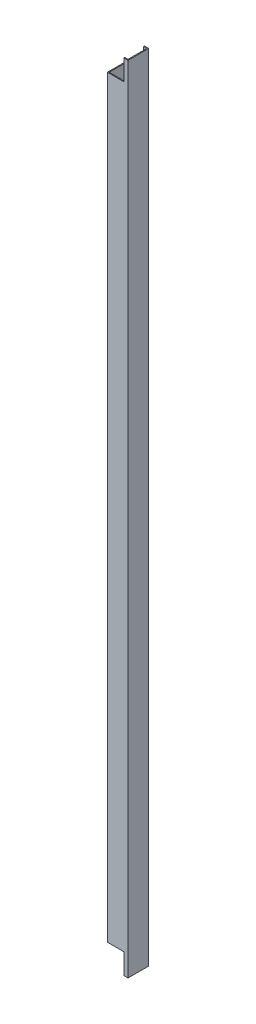
ISO-10303-21;
HEADER;
FILE_DESCRIPTION(('STEP AP214'),'2;1');
FILE_NAME('part.step','',(''),(''),'','','');
FILE_SCHEMA(('AUTOMOTIVE_DESIGN { 1 0 10303 214 1 1 1 1 }'));
ENDSEC;
DATA;
#1=APPLICATION_CONTEXT('core data for automotive mechanical design processes');
#2=APPLICATION_PROTOCOL_DEFINITION('international standard','automotive_design',2000,#1);
#3=PRODUCT_CONTEXT('',#1,'mechanical');
#4=PRODUCT('Part','Part','',(#3));
#5=PRODUCT_RELATED_PRODUCT_CATEGORY('part','',(#4));
#6=PRODUCT_DEFINITION_FORMATION('','',#4);
#7=PRODUCT_DEFINITION_CONTEXT('part definition',#1,'design');
#8=PRODUCT_DEFINITION('design','',#6,#7);
#9=PRODUCT_DEFINITION_SHAPE('','',#8);
#10=(LENGTH_UNIT() NAMED_UNIT(*) SI_UNIT(.MILLI.,.METRE.));
#11=(NAMED_UNIT(*) PLANE_ANGLE_UNIT() SI_UNIT($,.RADIAN.));
#12=(NAMED_UNIT(*) SI_UNIT($,.STERADIAN.) SOLID_ANGLE_UNIT());
#13=UNCERTAINTY_MEASURE_WITH_UNIT(LENGTH_MEASURE(1.E-05),#10,'distance_accuracy_value','');
#14=(GEOMETRIC_REPRESENTATION_CONTEXT(3) GLOBAL_UNCERTAINTY_ASSIGNED_CONTEXT((#13)) GLOBAL_UNIT_ASSIGNED_CONTEXT((#10,
#11,#12)) REPRESENTATION_CONTEXT('',''));
#15=CARTESIAN_POINT('',(0.,0.,0.));
#16=DIRECTION('',(0.,0.,1.));
#17=DIRECTION('',(1.,0.,0.));
#18=AXIS2_PLACEMENT_3D('',#15,#16,#17);
#19=CARTESIAN_POINT('',(0.,1923.,0.));
#20=DIRECTION('',(0.,-1.,0.));
#21=DIRECTION('',(0.,0.,-1.));
#22=AXIS2_PLACEMENT_3D('',#19,#20,#21);
#23=PLANE('',#22);
#24=DIRECTION('',(-1.,0.,0.));
#25=VECTOR('',#24,1.);
#26=CARTESIAN_POINT('',(0.,1923.,-50.));
#27=LINE('',#26,#25);
#28=CARTESIAN_POINT('',(50.,1923.,-50.));
#29=VERTEX_POINT('',#28);
#30=CARTESIAN_POINT('',(40.,1923.,-50.));
#31=VERTEX_POINT('',#30);
#32=EDGE_CURVE('E184',#29,#31,#27,.T.);
#33=ORIENTED_EDGE('',*,*,#32,.T.);
#34=DIRECTION('',(0.,0.,1.));
#35=VECTOR('',#34,1.);
#36=CARTESIAN_POINT('',(40.,1923.,-50.));
#37=LINE('',#36,#35);
#38=CARTESIAN_POINT('',(40.,1923.,-47.8));
#39=VERTEX_POINT('',#38);
#40=EDGE_CURVE('E257',#31,#39,#37,.T.);
#41=ORIENTED_EDGE('',*,*,#40,.T.);
#42=DIRECTION('',(-1.,0.,0.));
#43=VECTOR('',#42,1.);
#44=CARTESIAN_POINT('',(2.2,1923.,-47.8));
#45=LINE('',#44,#43);
#46=CARTESIAN_POINT('',(47.8,1923.,-47.8));
#47=VERTEX_POINT('',#46);
#48=EDGE_CURVE('E208',#47,#39,#45,.T.);
#49=ORIENTED_EDGE('',*,*,#48,.F.);
#50=DIRECTION('',(0.,0.,-1.));
#51=VECTOR('',#50,1.);
#52=CARTESIAN_POINT('',(47.8,1923.,-47.8));
#53=LINE('',#52,#51);
#54=CARTESIAN_POINT('',(47.8,1923.,-2.2));
#55=VERTEX_POINT('',#54);
#56=EDGE_CURVE('E213',#55,#47,#53,.T.);
#57=ORIENTED_EDGE('',*,*,#56,.F.);
#58=DIRECTION('',(1.,0.,0.));
#59=VECTOR('',#58,1.);
#60=CARTESIAN_POINT('',(47.8,1923.,-2.2));
#61=LINE('',#60,#59);
#62=CARTESIAN_POINT('',(40.,1923.,-2.2));
#63=VERTEX_POINT('',#62);
#64=EDGE_CURVE('E277',#63,#55,#61,.T.);
#65=ORIENTED_EDGE('',*,*,#64,.F.);
#66=CARTESIAN_POINT('',(40.,1923.,0.));
#67=VERTEX_POINT('',#66);
#68=EDGE_CURVE('E241',#63,#67,#37,.T.);
#69=ORIENTED_EDGE('',*,*,#68,.T.);
#70=DIRECTION('',(1.,0.,0.));
#71=VECTOR('',#70,1.);
#72=CARTESIAN_POINT('',(50.,1923.,0.));
#73=LINE('',#72,#71);
#74=CARTESIAN_POINT('',(50.,1923.,0.));
#75=VERTEX_POINT('',#74);
#76=EDGE_CURVE('E171',#67,#75,#73,.T.);
#77=ORIENTED_EDGE('',*,*,#76,.T.);
#78=DIRECTION('',(0.,0.,-1.));
#79=VECTOR('',#78,1.);
#80=CARTESIAN_POINT('',(50.,1923.,-50.));
#81=LINE('',#80,#79);
#82=EDGE_CURVE('E174',#75,#29,#81,.T.);
#83=ORIENTED_EDGE('',*,*,#82,.T.);
#84=EDGE_LOOP('',(#33,#41,#49,#57,#65,#69,#77,#83));
#85=FACE_BOUND('',#84,.T.);
#86=ADVANCED_FACE('F33',(#85),#23,.F.);
#87=CARTESIAN_POINT('',(0.,0.,0.));
#88=DIRECTION('',(0.,-1.,0.));
#89=DIRECTION('',(0.,0.,-1.));
#90=AXIS2_PLACEMENT_3D('',#87,#88,#89);
#91=PLANE('',#90);
#92=DIRECTION('',(0.,0.,1.));
#93=VECTOR('',#92,1.);
#94=CARTESIAN_POINT('',(40.,0.,-50.));
#95=LINE('',#94,#93);
#96=CARTESIAN_POINT('',(40.,0.,-50.));
#97=VERTEX_POINT('',#96);
#98=CARTESIAN_POINT('',(40.,0.,-47.8));
#99=VERTEX_POINT('',#98);
#100=EDGE_CURVE('E56',#97,#99,#95,.T.);
#101=ORIENTED_EDGE('',*,*,#100,.F.);
#102=DIRECTION('',(-1.,0.,0.));
#103=VECTOR('',#102,1.);
#104=CARTESIAN_POINT('',(0.,0.,-50.));
#105=LINE('',#104,#103);
#106=CARTESIAN_POINT('',(50.,0.,-50.));
#107=VERTEX_POINT('',#106);
#108=EDGE_CURVE('E159',#107,#97,#105,.T.);
#109=ORIENTED_EDGE('',*,*,#108,.F.);
#110=DIRECTION('',(0.,0.,-1.));
#111=VECTOR('',#110,1.);
#112=CARTESIAN_POINT('',(50.,0.,-50.));
#113=LINE('',#112,#111);
#114=CARTESIAN_POINT('',(50.,0.,0.));
#115=VERTEX_POINT('',#114);
#116=EDGE_CURVE('E172',#115,#107,#113,.T.);
#117=ORIENTED_EDGE('',*,*,#116,.F.);
#118=DIRECTION('',(1.,0.,0.));
#119=VECTOR('',#118,1.);
#120=CARTESIAN_POINT('',(50.,0.,0.));
#121=LINE('',#120,#119);
#122=CARTESIAN_POINT('',(40.,0.,0.));
#123=VERTEX_POINT('',#122);
#124=EDGE_CURVE('E176',#123,#115,#121,.T.);
#125=ORIENTED_EDGE('',*,*,#124,.F.);
#126=CARTESIAN_POINT('',(40.,0.,-2.2));
#127=VERTEX_POINT('',#126);
#128=EDGE_CURVE('E164',#127,#123,#95,.T.);
#129=ORIENTED_EDGE('',*,*,#128,.F.);
#130=DIRECTION('',(1.,0.,0.));
#131=VECTOR('',#130,1.);
#132=CARTESIAN_POINT('',(47.8,0.,-2.2));
#133=LINE('',#132,#131);
#134=CARTESIAN_POINT('',(47.8,0.,-2.2));
#135=VERTEX_POINT('',#134);
#136=EDGE_CURVE('E276',#127,#135,#133,.T.);
#137=ORIENTED_EDGE('',*,*,#136,.T.);
#138=DIRECTION('',(0.,0.,-1.));
#139=VECTOR('',#138,1.);
#140=CARTESIAN_POINT('',(47.8,0.,-47.8));
#141=LINE('',#140,#139);
#142=CARTESIAN_POINT('',(47.8,0.,-47.8));
#143=VERTEX_POINT('',#142);
#144=EDGE_CURVE('E281',#135,#143,#141,.T.);
#145=ORIENTED_EDGE('',*,*,#144,.T.);
#146=DIRECTION('',(-1.,0.,0.));
#147=VECTOR('',#146,1.);
#148=CARTESIAN_POINT('',(2.2,0.,-47.8));
#149=LINE('',#148,#147);
#150=EDGE_CURVE('E162',#143,#99,#149,.T.);
#151=ORIENTED_EDGE('',*,*,#150,.T.);
#152=EDGE_LOOP('',(#101,#109,#117,#125,#129,#137,#145,#151));
#153=FACE_BOUND('',#152,.T.);
#154=ADVANCED_FACE('F157',(#153),#91,.T.);
#155=CARTESIAN_POINT('',(50.,1923.,0.));
#156=DIRECTION('',(0.,0.,-1.));
#157=DIRECTION('',(-1.,0.,0.));
#158=AXIS2_PLACEMENT_3D('',#155,#156,#157);
#159=PLANE('',#158);
#160=DIRECTION('',(0.,-1.,0.));
#161=VECTOR('',#160,1.);
#162=CARTESIAN_POINT('',(0.,1923.,0.));
#163=LINE('',#162,#161);
#164=CARTESIAN_POINT('',(0.,1873.,0.));
#165=VERTEX_POINT('',#164);
#166=CARTESIAN_POINT('',(0.,50.,0.));
#167=VERTEX_POINT('',#166);
#168=EDGE_CURVE('E180',#165,#167,#163,.T.);
#169=ORIENTED_EDGE('',*,*,#168,.T.);
#170=DIRECTION('',(-1.,0.,0.));
#171=VECTOR('',#170,1.);
#172=CARTESIAN_POINT('',(0.,50.,0.));
#173=LINE('',#172,#171);
#174=CARTESIAN_POINT('',(40.,50.,0.));
#175=VERTEX_POINT('',#174);
#176=EDGE_CURVE('E152',#175,#167,#173,.T.);
#177=ORIENTED_EDGE('',*,*,#176,.F.);
#178=DIRECTION('',(0.,1.,0.));
#179=VECTOR('',#178,1.);
#180=CARTESIAN_POINT('',(40.,50.,0.));
#181=LINE('',#180,#179);
#182=EDGE_CURVE('E232',#123,#175,#181,.T.);
#183=ORIENTED_EDGE('',*,*,#182,.F.);
#184=ORIENTED_EDGE('',*,*,#124,.T.);
#185=DIRECTION('',(0.,-1.,0.));
#186=VECTOR('',#185,1.);
#187=CARTESIAN_POINT('',(50.,1923.,0.));
#188=LINE('',#187,#186);
#189=EDGE_CURVE('E188',#75,#115,#188,.T.);
#190=ORIENTED_EDGE('',*,*,#189,.F.);
#191=ORIENTED_EDGE('',*,*,#76,.F.);
#192=DIRECTION('',(0.,1.,0.));
#193=VECTOR('',#192,1.);
#194=CARTESIAN_POINT('',(40.,1923.,0.));
#195=LINE('',#194,#193);
#196=CARTESIAN_POINT('',(40.,1873.,0.));
#197=VERTEX_POINT('',#196);
#198=EDGE_CURVE('E244',#197,#67,#195,.T.);
#199=ORIENTED_EDGE('',*,*,#198,.F.);
#200=DIRECTION('',(1.,0.,0.));
#201=VECTOR('',#200,1.);
#202=CARTESIAN_POINT('',(40.,1873.,0.));
#203=LINE('',#202,#201);
#204=EDGE_CURVE('E246',#165,#197,#203,.T.);
#205=ORIENTED_EDGE('',*,*,#204,.F.);
#206=EDGE_LOOP('',(#169,#177,#183,#184,#190,#191,#199,#205));
#207=FACE_BOUND('',#206,.T.);
#208=ADVANCED_FACE('F35',(#207),#159,.F.);
#209=CARTESIAN_POINT('',(50.,1923.,-50.));
#210=DIRECTION('',(-1.,0.,0.));
#211=DIRECTION('',(0.,0.,1.));
#212=AXIS2_PLACEMENT_3D('',#209,#210,#211);
#213=PLANE('',#212);
#214=ORIENTED_EDGE('',*,*,#116,.T.);
#215=DIRECTION('',(0.,-1.,0.));
#216=VECTOR('',#215,1.);
#217=CARTESIAN_POINT('',(50.,1923.,-50.));
#218=LINE('',#217,#216);
#219=EDGE_CURVE('E170',#29,#107,#218,.T.);
#220=ORIENTED_EDGE('',*,*,#219,.F.);
#221=ORIENTED_EDGE('',*,*,#82,.F.);
#222=ORIENTED_EDGE('',*,*,#189,.T.);
#223=EDGE_LOOP('',(#214,#220,#221,#222));
#224=FACE_BOUND('',#223,.T.);
#225=ADVANCED_FACE('F236',(#224),#213,.F.);
#226=CARTESIAN_POINT('',(0.,1923.,-50.));
#227=DIRECTION('',(0.,0.,1.));
#228=DIRECTION('',(1.,0.,0.));
#229=AXIS2_PLACEMENT_3D('',#226,#227,#228);
#230=PLANE('',#229);
#231=DIRECTION('',(0.,1.,0.));
#232=VECTOR('',#231,1.);
#233=CARTESIAN_POINT('',(40.,50.,-50.));
#234=LINE('',#233,#232);
#235=CARTESIAN_POINT('',(40.,50.,-50.));
#236=VERTEX_POINT('',#235);
#237=EDGE_CURVE('E143',#97,#236,#234,.T.);
#238=ORIENTED_EDGE('',*,*,#237,.T.);
#239=DIRECTION('',(-1.,0.,0.));
#240=VECTOR('',#239,1.);
#241=CARTESIAN_POINT('',(0.,50.,-50.));
#242=LINE('',#241,#240);
#243=CARTESIAN_POINT('',(0.,50.,-50.));
#244=VERTEX_POINT('',#243);
#245=EDGE_CURVE('E151',#236,#244,#242,.T.);
#246=ORIENTED_EDGE('',*,*,#245,.T.);
#247=DIRECTION('',(0.,-1.,0.));
#248=VECTOR('',#247,1.);
#249=CARTESIAN_POINT('',(0.,1923.,-50.));
#250=LINE('',#249,#248);
#251=CARTESIAN_POINT('',(0.,1873.,-50.));
#252=VERTEX_POINT('',#251);
#253=EDGE_CURVE('E183',#252,#244,#250,.T.);
#254=ORIENTED_EDGE('',*,*,#253,.F.);
#255=DIRECTION('',(1.,0.,0.));
#256=VECTOR('',#255,1.);
#257=CARTESIAN_POINT('',(40.,1873.,-50.));
#258=LINE('',#257,#256);
#259=CARTESIAN_POINT('',(40.,1873.,-50.));
#260=VERTEX_POINT('',#259);
#261=EDGE_CURVE('E249',#252,#260,#258,.T.);
#262=ORIENTED_EDGE('',*,*,#261,.T.);
#263=DIRECTION('',(0.,1.,0.));
#264=VECTOR('',#263,1.);
#265=CARTESIAN_POINT('',(40.,1923.,-50.));
#266=LINE('',#265,#264);
#267=EDGE_CURVE('E252',#260,#31,#266,.T.);
#268=ORIENTED_EDGE('',*,*,#267,.T.);
#269=ORIENTED_EDGE('',*,*,#32,.F.);
#270=ORIENTED_EDGE('',*,*,#219,.T.);
#271=ORIENTED_EDGE('',*,*,#108,.T.);
#272=EDGE_LOOP('',(#238,#246,#254,#262,#268,#269,#270,#271));
#273=FACE_BOUND('',#272,.T.);
#274=ADVANCED_FACE('F167',(#273),#230,.F.);
#275=CARTESIAN_POINT('',(0.,1923.,0.));
#276=DIRECTION('',(1.,0.,0.));
#277=DIRECTION('',(0.,0.,-1.));
#278=AXIS2_PLACEMENT_3D('',#275,#276,#277);
#279=PLANE('',#278);
#280=ORIENTED_EDGE('',*,*,#253,.T.);
#281=DIRECTION('',(0.,0.,1.));
#282=VECTOR('',#281,1.);
#283=CARTESIAN_POINT('',(0.,50.,-50.));
#284=LINE('',#283,#282);
#285=EDGE_CURVE('E199',#244,#167,#284,.T.);
#286=ORIENTED_EDGE('',*,*,#285,.T.);
#287=ORIENTED_EDGE('',*,*,#168,.F.);
#288=DIRECTION('',(0.,0.,1.));
#289=VECTOR('',#288,1.);
#290=CARTESIAN_POINT('',(0.,1873.,-50.));
#291=LINE('',#290,#289);
#292=EDGE_CURVE('E263',#252,#165,#291,.T.);
#293=ORIENTED_EDGE('',*,*,#292,.F.);
#294=EDGE_LOOP('',(#280,#286,#287,#293));
#295=FACE_BOUND('',#294,.T.);
#296=ADVANCED_FACE('F314',(#295),#279,.F.);
#297=CARTESIAN_POINT('',(2.2,1923.,-2.2));
#298=DIRECTION('',(1.,0.,0.));
#299=DIRECTION('',(0.,0.,-1.));
#300=AXIS2_PLACEMENT_3D('',#297,#298,#299);
#301=PLANE('',#300);
#302=DIRECTION('',(0.,0.,1.));
#303=VECTOR('',#302,1.);
#304=CARTESIAN_POINT('',(2.2,50.,-2.2));
#305=LINE('',#304,#303);
#306=CARTESIAN_POINT('',(2.2,50.,-47.8));
#307=VERTEX_POINT('',#306);
#308=CARTESIAN_POINT('',(2.2,50.,-2.2));
#309=VERTEX_POINT('',#308);
#310=EDGE_CURVE('E272',#307,#309,#305,.T.);
#311=ORIENTED_EDGE('',*,*,#310,.F.);
#312=DIRECTION('',(0.,-1.,0.));
#313=VECTOR('',#312,1.);
#314=CARTESIAN_POINT('',(2.2,1923.,-47.8));
#315=LINE('',#314,#313);
#316=CARTESIAN_POINT('',(2.2,1873.,-47.8));
#317=VERTEX_POINT('',#316);
#318=EDGE_CURVE('E204',#317,#307,#315,.T.);
#319=ORIENTED_EDGE('',*,*,#318,.F.);
#320=DIRECTION('',(0.,0.,-1.));
#321=VECTOR('',#320,1.);
#322=CARTESIAN_POINT('',(2.2,1873.,-2.2));
#323=LINE('',#322,#321);
#324=CARTESIAN_POINT('',(2.2,1873.,-2.2));
#325=VERTEX_POINT('',#324);
#326=EDGE_CURVE('E48',#325,#317,#323,.T.);
#327=ORIENTED_EDGE('',*,*,#326,.F.);
#328=DIRECTION('',(0.,-1.,0.));
#329=VECTOR('',#328,1.);
#330=CARTESIAN_POINT('',(2.2,1923.,-2.2));
#331=LINE('',#330,#329);
#332=EDGE_CURVE('E220',#325,#309,#331,.T.);
#333=ORIENTED_EDGE('',*,*,#332,.T.);
#334=EDGE_LOOP('',(#311,#319,#327,#333));
#335=FACE_BOUND('',#334,.T.);
#336=ADVANCED_FACE('F315',(#335),#301,.T.);
#337=CARTESIAN_POINT('',(47.8,1923.,-2.2));
#338=DIRECTION('',(0.,0.,-1.));
#339=DIRECTION('',(-1.,0.,0.));
#340=AXIS2_PLACEMENT_3D('',#337,#338,#339);
#341=PLANE('',#340);
#342=DIRECTION('',(1.,0.,0.));
#343=VECTOR('',#342,1.);
#344=CARTESIAN_POINT('',(47.8,50.,-2.2));
#345=LINE('',#344,#343);
#346=CARTESIAN_POINT('',(40.,50.,-2.2));
#347=VERTEX_POINT('',#346);
#348=EDGE_CURVE('E274',#309,#347,#345,.T.);
#349=ORIENTED_EDGE('',*,*,#348,.F.);
#350=ORIENTED_EDGE('',*,*,#332,.F.);
#351=DIRECTION('',(-1.,0.,0.));
#352=VECTOR('',#351,1.);
#353=CARTESIAN_POINT('',(47.8,1873.,-2.2));
#354=LINE('',#353,#352);
#355=CARTESIAN_POINT('',(40.,1873.,-2.2));
#356=VERTEX_POINT('',#355);
#357=EDGE_CURVE('E266',#356,#325,#354,.T.);
#358=ORIENTED_EDGE('',*,*,#357,.F.);
#359=DIRECTION('',(0.,-1.,0.));
#360=VECTOR('',#359,1.);
#361=CARTESIAN_POINT('',(40.,1923.,-2.2));
#362=LINE('',#361,#360);
#363=EDGE_CURVE('E268',#63,#356,#362,.T.);
#364=ORIENTED_EDGE('',*,*,#363,.F.);
#365=ORIENTED_EDGE('',*,*,#64,.T.);
#366=DIRECTION('',(0.,-1.,0.));
#367=VECTOR('',#366,1.);
#368=CARTESIAN_POINT('',(47.8,1923.,-2.2));
#369=LINE('',#368,#367);
#370=EDGE_CURVE('E210',#55,#135,#369,.T.);
#371=ORIENTED_EDGE('',*,*,#370,.T.);
#372=ORIENTED_EDGE('',*,*,#136,.F.);
#373=DIRECTION('',(0.,-1.,0.));
#374=VECTOR('',#373,1.);
#375=CARTESIAN_POINT('',(39.9999999999995,1923.,-2.2));
#376=LINE('',#375,#374);
#377=EDGE_CURVE('E270',#347,#127,#376,.T.);
#378=ORIENTED_EDGE('',*,*,#377,.F.);
#379=EDGE_LOOP('',(#349,#350,#358,#364,#365,#371,#372,#378));
#380=FACE_BOUND('',#379,.T.);
#381=ADVANCED_FACE('F305',(#380),#341,.T.);
#382=CARTESIAN_POINT('',(47.8,1923.,-47.8));
#383=DIRECTION('',(-1.,0.,0.));
#384=DIRECTION('',(0.,0.,1.));
#385=AXIS2_PLACEMENT_3D('',#382,#383,#384);
#386=PLANE('',#385);
#387=ORIENTED_EDGE('',*,*,#144,.F.);
#388=ORIENTED_EDGE('',*,*,#370,.F.);
#389=ORIENTED_EDGE('',*,*,#56,.T.);
#390=DIRECTION('',(0.,-1.,0.));
#391=VECTOR('',#390,1.);
#392=CARTESIAN_POINT('',(47.8,1923.,-47.8));
#393=LINE('',#392,#391);
#394=EDGE_CURVE('E207',#47,#143,#393,.T.);
#395=ORIENTED_EDGE('',*,*,#394,.T.);
#396=EDGE_LOOP('',(#387,#388,#389,#395));
#397=FACE_BOUND('',#396,.T.);
#398=ADVANCED_FACE('F286',(#397),#386,.T.);
#399=CARTESIAN_POINT('',(2.2,1923.,-47.8));
#400=DIRECTION('',(0.,0.,1.));
#401=DIRECTION('',(1.,0.,0.));
#402=AXIS2_PLACEMENT_3D('',#399,#400,#401);
#403=PLANE('',#402);
#404=DIRECTION('',(-1.,0.,0.));
#405=VECTOR('',#404,1.);
#406=CARTESIAN_POINT('',(2.2,50.,-47.8));
#407=LINE('',#406,#405);
#408=CARTESIAN_POINT('',(40.,50.,-47.8));
#409=VERTEX_POINT('',#408);
#410=EDGE_CURVE('E11',#409,#307,#407,.T.);
#411=ORIENTED_EDGE('',*,*,#410,.F.);
#412=DIRECTION('',(0.,1.,0.));
#413=VECTOR('',#412,1.);
#414=CARTESIAN_POINT('',(39.9999999999995,1923.,-47.8));
#415=LINE('',#414,#413);
#416=EDGE_CURVE('E41',#99,#409,#415,.T.);
#417=ORIENTED_EDGE('',*,*,#416,.F.);
#418=ORIENTED_EDGE('',*,*,#150,.F.);
#419=ORIENTED_EDGE('',*,*,#394,.F.);
#420=ORIENTED_EDGE('',*,*,#48,.T.);
#421=DIRECTION('',(0.,1.,0.));
#422=VECTOR('',#421,1.);
#423=CARTESIAN_POINT('',(40.,1923.,-47.8));
#424=LINE('',#423,#422);
#425=CARTESIAN_POINT('',(40.,1873.,-47.8));
#426=VERTEX_POINT('',#425);
#427=EDGE_CURVE('E193',#426,#39,#424,.T.);
#428=ORIENTED_EDGE('',*,*,#427,.F.);
#429=DIRECTION('',(1.,0.,0.));
#430=VECTOR('',#429,1.);
#431=CARTESIAN_POINT('',(2.2,1873.,-47.8));
#432=LINE('',#431,#430);
#433=EDGE_CURVE('E191',#317,#426,#432,.T.);
#434=ORIENTED_EDGE('',*,*,#433,.F.);
#435=ORIENTED_EDGE('',*,*,#318,.T.);
#436=EDGE_LOOP('',(#411,#417,#418,#419,#420,#428,#434,#435));
#437=FACE_BOUND('',#436,.T.);
#438=ADVANCED_FACE('F202',(#437),#403,.T.);
#439=CARTESIAN_POINT('',(40.,1923.,-50.));
#440=DIRECTION('',(1.,0.,0.));
#441=DIRECTION('',(0.,0.,-1.));
#442=AXIS2_PLACEMENT_3D('',#439,#440,#441);
#443=PLANE('',#442);
#444=ORIENTED_EDGE('',*,*,#363,.T.);
#445=DIRECTION('',(0.,0.,1.));
#446=VECTOR('',#445,1.);
#447=CARTESIAN_POINT('',(40.,1873.,-50.));
#448=LINE('',#447,#446);
#449=EDGE_CURVE('E262',#356,#197,#448,.T.);
#450=ORIENTED_EDGE('',*,*,#449,.T.);
#451=ORIENTED_EDGE('',*,*,#198,.T.);
#452=ORIENTED_EDGE('',*,*,#68,.F.);
#453=EDGE_LOOP('',(#444,#450,#451,#452));
#454=FACE_BOUND('',#453,.T.);
#455=ADVANCED_FACE('F310',(#454),#443,.F.);
#456=ORIENTED_EDGE('',*,*,#427,.T.);
#457=ORIENTED_EDGE('',*,*,#40,.F.);
#458=ORIENTED_EDGE('',*,*,#267,.F.);
#459=EDGE_CURVE('E259',#260,#426,#448,.T.);
#460=ORIENTED_EDGE('',*,*,#459,.T.);
#461=EDGE_LOOP('',(#456,#457,#458,#460));
#462=FACE_BOUND('',#461,.T.);
#463=ADVANCED_FACE('F292',(#462),#443,.F.);
#464=CARTESIAN_POINT('',(40.,1873.,-50.));
#465=DIRECTION('',(0.,-1.,0.));
#466=DIRECTION('',(0.,0.,-1.));
#467=AXIS2_PLACEMENT_3D('',#464,#465,#466);
#468=PLANE('',#467);
#469=ORIENTED_EDGE('',*,*,#357,.T.);
#470=ORIENTED_EDGE('',*,*,#326,.T.);
#471=ORIENTED_EDGE('',*,*,#433,.T.);
#472=ORIENTED_EDGE('',*,*,#459,.F.);
#473=ORIENTED_EDGE('',*,*,#261,.F.);
#474=ORIENTED_EDGE('',*,*,#292,.T.);
#475=ORIENTED_EDGE('',*,*,#204,.T.);
#476=ORIENTED_EDGE('',*,*,#449,.F.);
#477=EDGE_LOOP('',(#469,#470,#471,#472,#473,#474,#475,#476));
#478=FACE_BOUND('',#477,.T.);
#479=ADVANCED_FACE('F311',(#478),#468,.F.);
#480=CARTESIAN_POINT('',(40.,50.,-50.));
#481=DIRECTION('',(1.,0.,0.));
#482=DIRECTION('',(0.,1.,0.));
#483=AXIS2_PLACEMENT_3D('',#480,#481,#482);
#484=PLANE('',#483);
#485=ORIENTED_EDGE('',*,*,#377,.T.);
#486=ORIENTED_EDGE('',*,*,#128,.T.);
#487=ORIENTED_EDGE('',*,*,#182,.T.);
#488=DIRECTION('',(0.,0.,1.));
#489=VECTOR('',#488,1.);
#490=CARTESIAN_POINT('',(40.,50.,-50.));
#491=LINE('',#490,#489);
#492=EDGE_CURVE('E163',#347,#175,#491,.T.);
#493=ORIENTED_EDGE('',*,*,#492,.F.);
#494=EDGE_LOOP('',(#485,#486,#487,#493));
#495=FACE_BOUND('',#494,.T.);
#496=ADVANCED_FACE('F300',(#495),#484,.F.);
#497=CARTESIAN_POINT('',(0.,50.,-50.));
#498=DIRECTION('',(0.,1.,0.));
#499=DIRECTION('',(0.,0.,1.));
#500=AXIS2_PLACEMENT_3D('',#497,#498,#499);
#501=PLANE('',#500);
#502=ORIENTED_EDGE('',*,*,#348,.T.);
#503=ORIENTED_EDGE('',*,*,#492,.T.);
#504=ORIENTED_EDGE('',*,*,#176,.T.);
#505=ORIENTED_EDGE('',*,*,#285,.F.);
#506=ORIENTED_EDGE('',*,*,#245,.F.);
#507=EDGE_CURVE('E146',#236,#409,#491,.T.);
#508=ORIENTED_EDGE('',*,*,#507,.T.);
#509=ORIENTED_EDGE('',*,*,#410,.T.);
#510=ORIENTED_EDGE('',*,*,#310,.T.);
#511=EDGE_LOOP('',(#502,#503,#504,#505,#506,#508,#509,#510));
#512=FACE_BOUND('',#511,.T.);
#513=ADVANCED_FACE('F197',(#512),#501,.F.);
#514=ORIENTED_EDGE('',*,*,#416,.T.);
#515=ORIENTED_EDGE('',*,*,#507,.F.);
#516=ORIENTED_EDGE('',*,*,#237,.F.);
#517=ORIENTED_EDGE('',*,*,#100,.T.);
#518=EDGE_LOOP('',(#514,#515,#516,#517));
#519=FACE_BOUND('',#518,.T.);
#520=ADVANCED_FACE('F144',(#519),#484,.F.);
#521=CLOSED_SHELL('',(#86,#154,#208,#225,#274,#296,#336,#381,#398,#438,#455,#463,#479,#496,#513,#520));
#522=MANIFOLD_SOLID_BREP('B2',#521);
#523=ADVANCED_BREP_SHAPE_REPRESENTATION('',(#18,#522),#14);
#524=SHAPE_DEFINITION_REPRESENTATION(#9,#523);
ENDSEC;
END-ISO-10303-21;
